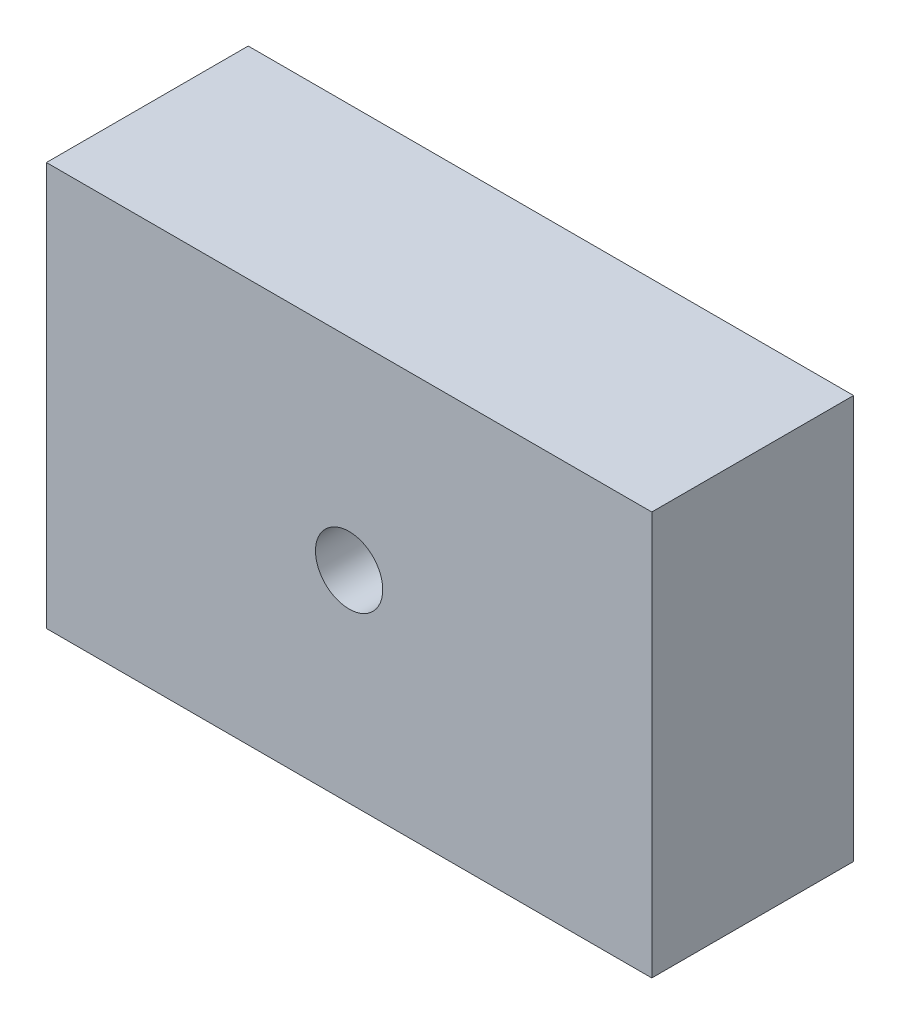
ISO-10303-21;
HEADER;
FILE_DESCRIPTION(('STEP AP214'),'2;1');
FILE_NAME('part.step','',(''),(''),'','','');
FILE_SCHEMA(('AUTOMOTIVE_DESIGN { 1 0 10303 214 1 1 1 1 }'));
ENDSEC;
DATA;
#1=APPLICATION_CONTEXT('core data for automotive mechanical design processes');
#2=APPLICATION_PROTOCOL_DEFINITION('international standard','automotive_design',2000,#1);
#3=PRODUCT_CONTEXT('',#1,'mechanical');
#4=PRODUCT('Part','Part','',(#3));
#5=PRODUCT_RELATED_PRODUCT_CATEGORY('part','',(#4));
#6=PRODUCT_DEFINITION_FORMATION('','',#4);
#7=PRODUCT_DEFINITION_CONTEXT('part definition',#1,'design');
#8=PRODUCT_DEFINITION('design','',#6,#7);
#9=PRODUCT_DEFINITION_SHAPE('','',#8);
#10=(LENGTH_UNIT() NAMED_UNIT(*) SI_UNIT(.MILLI.,.METRE.));
#11=(NAMED_UNIT(*) PLANE_ANGLE_UNIT() SI_UNIT($,.RADIAN.));
#12=(NAMED_UNIT(*) SI_UNIT($,.STERADIAN.) SOLID_ANGLE_UNIT());
#13=UNCERTAINTY_MEASURE_WITH_UNIT(LENGTH_MEASURE(1.E-05),#10,'distance_accuracy_value','');
#14=(GEOMETRIC_REPRESENTATION_CONTEXT(3) GLOBAL_UNCERTAINTY_ASSIGNED_CONTEXT((#13)) GLOBAL_UNIT_ASSIGNED_CONTEXT((#10,
#11,#12)) REPRESENTATION_CONTEXT('',''));
#15=CARTESIAN_POINT('',(0.,0.,0.));
#16=DIRECTION('',(0.,0.,1.));
#17=DIRECTION('',(1.,0.,0.));
#18=AXIS2_PLACEMENT_3D('',#15,#16,#17);
#19=CARTESIAN_POINT('',(0.,0.,30.));
#20=DIRECTION('',(1.,0.,0.));
#21=DIRECTION('',(0.,0.,-1.));
#22=AXIS2_PLACEMENT_3D('',#19,#20,#21);
#23=PLANE('',#22);
#24=DIRECTION('',(0.,-1.,0.));
#25=VECTOR('',#24,1.);
#26=CARTESIAN_POINT('',(0.,0.,0.));
#27=LINE('',#26,#25);
#28=CARTESIAN_POINT('',(0.,60.,0.));
#29=VERTEX_POINT('',#28);
#30=CARTESIAN_POINT('',(0.,0.,0.));
#31=VERTEX_POINT('',#30);
#32=EDGE_CURVE('E96',#29,#31,#27,.T.);
#33=ORIENTED_EDGE('',*,*,#32,.T.);
#34=DIRECTION('',(0.,0.,-1.));
#35=VECTOR('',#34,1.);
#36=CARTESIAN_POINT('',(0.,0.,30.));
#37=LINE('',#36,#35);
#38=CARTESIAN_POINT('',(0.,0.,30.));
#39=VERTEX_POINT('',#38);
#40=EDGE_CURVE('E11',#39,#31,#37,.T.);
#41=ORIENTED_EDGE('',*,*,#40,.F.);
#42=DIRECTION('',(0.,-1.,0.));
#43=VECTOR('',#42,1.);
#44=CARTESIAN_POINT('',(0.,0.,30.));
#45=LINE('',#44,#43);
#46=CARTESIAN_POINT('',(0.,60.,30.));
#47=VERTEX_POINT('',#46);
#48=EDGE_CURVE('E84',#47,#39,#45,.T.);
#49=ORIENTED_EDGE('',*,*,#48,.F.);
#50=DIRECTION('',(0.,0.,-1.));
#51=VECTOR('',#50,1.);
#52=CARTESIAN_POINT('',(0.,60.,30.));
#53=LINE('',#52,#51);
#54=EDGE_CURVE('E92',#47,#29,#53,.T.);
#55=ORIENTED_EDGE('',*,*,#54,.T.);
#56=EDGE_LOOP('',(#33,#41,#49,#55));
#57=FACE_BOUND('',#56,.T.);
#58=ADVANCED_FACE('F33',(#57),#23,.F.);
#59=CARTESIAN_POINT('',(0.,0.,30.));
#60=DIRECTION('',(0.,1.,0.));
#61=DIRECTION('',(0.,0.,1.));
#62=AXIS2_PLACEMENT_3D('',#59,#60,#61);
#63=PLANE('',#62);
#64=DIRECTION('',(1.,0.,0.));
#65=VECTOR('',#64,1.);
#66=CARTESIAN_POINT('',(0.,0.,0.));
#67=LINE('',#66,#65);
#68=CARTESIAN_POINT('',(90.,0.,0.));
#69=VERTEX_POINT('',#68);
#70=EDGE_CURVE('E88',#31,#69,#67,.T.);
#71=ORIENTED_EDGE('',*,*,#70,.T.);
#72=DIRECTION('',(0.,0.,-1.));
#73=VECTOR('',#72,1.);
#74=CARTESIAN_POINT('',(90.,0.,30.));
#75=LINE('',#74,#73);
#76=CARTESIAN_POINT('',(90.,0.,30.));
#77=VERTEX_POINT('',#76);
#78=EDGE_CURVE('E41',#77,#69,#75,.T.);
#79=ORIENTED_EDGE('',*,*,#78,.F.);
#80=DIRECTION('',(1.,0.,0.));
#81=VECTOR('',#80,1.);
#82=CARTESIAN_POINT('',(0.,0.,30.));
#83=LINE('',#82,#81);
#84=EDGE_CURVE('E79',#39,#77,#83,.T.);
#85=ORIENTED_EDGE('',*,*,#84,.F.);
#86=ORIENTED_EDGE('',*,*,#40,.T.);
#87=EDGE_LOOP('',(#71,#79,#85,#86));
#88=FACE_BOUND('',#87,.T.);
#89=ADVANCED_FACE('F87',(#88),#63,.F.);
#90=CARTESIAN_POINT('',(90.,0.,30.));
#91=DIRECTION('',(-1.,0.,0.));
#92=DIRECTION('',(0.,0.,1.));
#93=AXIS2_PLACEMENT_3D('',#90,#91,#92);
#94=PLANE('',#93);
#95=DIRECTION('',(0.,1.,0.));
#96=VECTOR('',#95,1.);
#97=CARTESIAN_POINT('',(90.,0.,0.));
#98=LINE('',#97,#96);
#99=CARTESIAN_POINT('',(90.,60.,0.));
#100=VERTEX_POINT('',#99);
#101=EDGE_CURVE('E66',#69,#100,#98,.T.);
#102=ORIENTED_EDGE('',*,*,#101,.T.);
#103=DIRECTION('',(0.,0.,-1.));
#104=VECTOR('',#103,1.);
#105=CARTESIAN_POINT('',(90.,60.,30.));
#106=LINE('',#105,#104);
#107=CARTESIAN_POINT('',(90.,60.,30.));
#108=VERTEX_POINT('',#107);
#109=EDGE_CURVE('E89',#108,#100,#106,.T.);
#110=ORIENTED_EDGE('',*,*,#109,.F.);
#111=DIRECTION('',(0.,1.,0.));
#112=VECTOR('',#111,1.);
#113=CARTESIAN_POINT('',(90.,0.,30.));
#114=LINE('',#113,#112);
#115=EDGE_CURVE('E82',#77,#108,#114,.T.);
#116=ORIENTED_EDGE('',*,*,#115,.F.);
#117=ORIENTED_EDGE('',*,*,#78,.T.);
#118=EDGE_LOOP('',(#102,#110,#116,#117));
#119=FACE_BOUND('',#118,.T.);
#120=ADVANCED_FACE('F90',(#119),#94,.F.);
#121=CARTESIAN_POINT('',(0.,60.,30.));
#122=DIRECTION('',(0.,-1.,0.));
#123=DIRECTION('',(0.,0.,-1.));
#124=AXIS2_PLACEMENT_3D('',#121,#122,#123);
#125=PLANE('',#124);
#126=DIRECTION('',(-1.,0.,0.));
#127=VECTOR('',#126,1.);
#128=CARTESIAN_POINT('',(0.,60.,0.));
#129=LINE('',#128,#127);
#130=EDGE_CURVE('E72',#100,#29,#129,.T.);
#131=ORIENTED_EDGE('',*,*,#130,.T.);
#132=ORIENTED_EDGE('',*,*,#54,.F.);
#133=DIRECTION('',(-1.,0.,0.));
#134=VECTOR('',#133,1.);
#135=CARTESIAN_POINT('',(0.,60.,30.));
#136=LINE('',#135,#134);
#137=EDGE_CURVE('E49',#108,#47,#136,.T.);
#138=ORIENTED_EDGE('',*,*,#137,.F.);
#139=ORIENTED_EDGE('',*,*,#109,.T.);
#140=EDGE_LOOP('',(#131,#132,#138,#139));
#141=FACE_BOUND('',#140,.T.);
#142=ADVANCED_FACE('F104',(#141),#125,.F.);
#143=CARTESIAN_POINT('',(0.,0.,30.));
#144=DIRECTION('',(0.,0.,-1.));
#145=DIRECTION('',(-1.,0.,0.));
#146=AXIS2_PLACEMENT_3D('',#143,#144,#145);
#147=PLANE('',#146);
#148=CARTESIAN_POINT('',(45.,30.,30.));
#149=DIRECTION('',(0.,0.,1.));
#150=DIRECTION('',(1.,0.,0.));
#151=AXIS2_PLACEMENT_3D('',#148,#149,#150);
#152=CIRCLE('',#151,5.);
#153=CARTESIAN_POINT('',(50.,30.,30.));
#154=VERTEX_POINT('',#153);
#155=EDGE_CURVE('E110',#154,#154,#152,.T.);
#156=ORIENTED_EDGE('',*,*,#155,.F.);
#157=EDGE_LOOP('',(#156));
#158=FACE_BOUND('',#157,.T.);
#159=ORIENTED_EDGE('',*,*,#48,.T.);
#160=ORIENTED_EDGE('',*,*,#84,.T.);
#161=ORIENTED_EDGE('',*,*,#115,.T.);
#162=ORIENTED_EDGE('',*,*,#137,.T.);
#163=EDGE_LOOP('',(#159,#160,#161,#162));
#164=FACE_BOUND('',#163,.T.);
#165=ADVANCED_FACE('F80',(#158,#164),#147,.F.);
#166=CARTESIAN_POINT('',(0.,0.,0.));
#167=DIRECTION('',(0.,0.,-1.));
#168=DIRECTION('',(-1.,0.,0.));
#169=AXIS2_PLACEMENT_3D('',#166,#167,#168);
#170=PLANE('',#169);
#171=ORIENTED_EDGE('',*,*,#32,.F.);
#172=ORIENTED_EDGE('',*,*,#130,.F.);
#173=ORIENTED_EDGE('',*,*,#101,.F.);
#174=ORIENTED_EDGE('',*,*,#70,.F.);
#175=EDGE_LOOP('',(#171,#172,#173,#174));
#176=FACE_BOUND('',#175,.T.);
#177=ADVANCED_FACE('F107',(#176),#170,.T.);
#178=CARTESIAN_POINT('',(45.,30.,20.));
#179=DIRECTION('',(0.,0.,1.));
#180=DIRECTION('',(1.,0.,0.));
#181=AXIS2_PLACEMENT_3D('',#178,#179,#180);
#182=CYLINDRICAL_SURFACE('',#181,5.);
#183=CARTESIAN_POINT('',(45.,30.,20.));
#184=DIRECTION('',(0.,0.,1.));
#185=DIRECTION('',(1.,0.,0.));
#186=AXIS2_PLACEMENT_3D('',#183,#184,#185);
#187=CIRCLE('',#186,5.);
#188=CARTESIAN_POINT('',(50.,30.,20.));
#189=VERTEX_POINT('',#188);
#190=EDGE_CURVE('E99',#189,#189,#187,.T.);
#191=ORIENTED_EDGE('',*,*,#190,.F.);
#192=EDGE_LOOP('',(#191));
#193=FACE_BOUND('',#192,.T.);
#194=ORIENTED_EDGE('',*,*,#155,.T.);
#195=EDGE_LOOP('',(#194));
#196=FACE_BOUND('',#195,.T.);
#197=ADVANCED_FACE('F118',(#193,#196),#182,.F.);
#198=CARTESIAN_POINT('',(45.,30.,20.));
#199=DIRECTION('',(0.,0.,1.));
#200=DIRECTION('',(1.,0.,0.));
#201=AXIS2_PLACEMENT_3D('',#198,#199,#200);
#202=PLANE('',#201);
#203=ORIENTED_EDGE('',*,*,#190,.T.);
#204=EDGE_LOOP('',(#203));
#205=FACE_BOUND('',#204,.T.);
#206=ADVANCED_FACE('F116',(#205),#202,.T.);
#207=CLOSED_SHELL('',(#58,#89,#120,#142,#165,#177,#197,#206));
#208=MANIFOLD_SOLID_BREP('B2',#207);
#209=ADVANCED_BREP_SHAPE_REPRESENTATION('',(#18,#208),#14);
#210=SHAPE_DEFINITION_REPRESENTATION(#9,#209);
ENDSEC;
END-ISO-10303-21;
